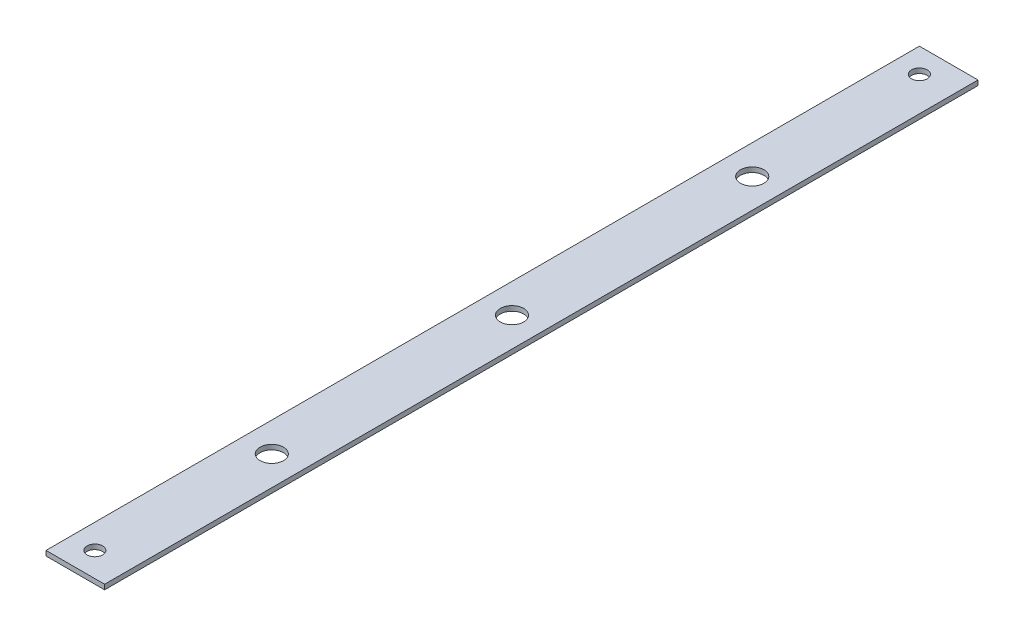
ISO-10303-21;
HEADER;
FILE_DESCRIPTION(('STEP AP214'),'2;1');
FILE_NAME('part.step','',(''),(''),'','','');
FILE_SCHEMA(('AUTOMOTIVE_DESIGN { 1 0 10303 214 1 1 1 1 }'));
ENDSEC;
DATA;
#1=APPLICATION_CONTEXT('core data for automotive mechanical design processes');
#2=APPLICATION_PROTOCOL_DEFINITION('international standard','automotive_design',2000,#1);
#3=PRODUCT_CONTEXT('',#1,'mechanical');
#4=PRODUCT('Part','Part','',(#3));
#5=PRODUCT_RELATED_PRODUCT_CATEGORY('part','',(#4));
#6=PRODUCT_DEFINITION_FORMATION('','',#4);
#7=PRODUCT_DEFINITION_CONTEXT('part definition',#1,'design');
#8=PRODUCT_DEFINITION('design','',#6,#7);
#9=PRODUCT_DEFINITION_SHAPE('','',#8);
#10=(LENGTH_UNIT() NAMED_UNIT(*) SI_UNIT(.MILLI.,.METRE.));
#11=(NAMED_UNIT(*) PLANE_ANGLE_UNIT() SI_UNIT($,.RADIAN.));
#12=(NAMED_UNIT(*) SI_UNIT($,.STERADIAN.) SOLID_ANGLE_UNIT());
#13=UNCERTAINTY_MEASURE_WITH_UNIT(LENGTH_MEASURE(1.E-05),#10,'distance_accuracy_value','');
#14=(GEOMETRIC_REPRESENTATION_CONTEXT(3) GLOBAL_UNCERTAINTY_ASSIGNED_CONTEXT((#13)) GLOBAL_UNIT_ASSIGNED_CONTEXT((#10,
#11,#12)) REPRESENTATION_CONTEXT('',''));
#15=CARTESIAN_POINT('',(0.,0.,0.));
#16=DIRECTION('',(0.,0.,1.));
#17=DIRECTION('',(1.,0.,0.));
#18=AXIS2_PLACEMENT_3D('',#15,#16,#17);
#19=CARTESIAN_POINT('',(30.,0.,223.6));
#20=DIRECTION('',(0.,1.,0.));
#21=DIRECTION('',(-1.,0.,0.));
#22=AXIS2_PLACEMENT_3D('',#19,#20,#21);
#23=PLANE('',#22);
#24=CARTESIAN_POINT('',(15.,0.,-123.));
#25=DIRECTION('',(0.,1.,0.));
#26=DIRECTION('',(1.,0.,0.));
#27=AXIS2_PLACEMENT_3D('',#24,#25,#26);
#28=CIRCLE('',#27,6.00000000000001);
#29=CARTESIAN_POINT('',(21.,0.,-123.));
#30=VERTEX_POINT('',#29);
#31=EDGE_CURVE('E131',#30,#30,#28,.T.);
#32=ORIENTED_EDGE('',*,*,#31,.T.);
#33=EDGE_LOOP('',(#32));
#34=FACE_BOUND('',#33,.T.);
#35=CARTESIAN_POINT('',(15.,0.,123.));
#36=DIRECTION('',(0.,1.,0.));
#37=DIRECTION('',(-1.,0.,0.));
#38=AXIS2_PLACEMENT_3D('',#35,#36,#37);
#39=CIRCLE('',#38,6.00000000000001);
#40=CARTESIAN_POINT('',(8.99999999999999,0.,123.));
#41=VERTEX_POINT('',#40);
#42=EDGE_CURVE('E125',#41,#41,#39,.T.);
#43=ORIENTED_EDGE('',*,*,#42,.T.);
#44=EDGE_LOOP('',(#43));
#45=FACE_BOUND('',#44,.T.);
#46=CARTESIAN_POINT('',(12.5,0.,211.1));
#47=DIRECTION('',(0.,1.,0.));
#48=DIRECTION('',(1.,0.,0.));
#49=AXIS2_PLACEMENT_3D('',#46,#47,#48);
#50=CIRCLE('',#49,4.);
#51=CARTESIAN_POINT('',(16.5,0.,211.1));
#52=VERTEX_POINT('',#51);
#53=EDGE_CURVE('E119',#52,#52,#50,.T.);
#54=ORIENTED_EDGE('',*,*,#53,.T.);
#55=EDGE_LOOP('',(#54));
#56=FACE_BOUND('',#55,.T.);
#57=CARTESIAN_POINT('',(15.,0.,0.));
#58=DIRECTION('',(0.,1.,0.));
#59=DIRECTION('',(-1.,0.,0.));
#60=AXIS2_PLACEMENT_3D('',#57,#58,#59);
#61=CIRCLE('',#60,6.);
#62=CARTESIAN_POINT('',(9.,0.,0.));
#63=VERTEX_POINT('',#62);
#64=EDGE_CURVE('E113',#63,#63,#61,.T.);
#65=ORIENTED_EDGE('',*,*,#64,.T.);
#66=EDGE_LOOP('',(#65));
#67=FACE_BOUND('',#66,.T.);
#68=CARTESIAN_POINT('',(12.5,0.,-211.1));
#69=DIRECTION('',(0.,1.,0.));
#70=DIRECTION('',(-1.,0.,0.));
#71=AXIS2_PLACEMENT_3D('',#68,#69,#70);
#72=CIRCLE('',#71,4.);
#73=CARTESIAN_POINT('',(8.5,0.,-211.1));
#74=VERTEX_POINT('',#73);
#75=EDGE_CURVE('E99',#74,#74,#72,.T.);
#76=ORIENTED_EDGE('',*,*,#75,.T.);
#77=EDGE_LOOP('',(#76));
#78=FACE_BOUND('',#77,.T.);
#79=DIRECTION('',(1.,0.,0.));
#80=VECTOR('',#79,1.);
#81=CARTESIAN_POINT('',(30.,0.,-223.6));
#82=LINE('',#81,#80);
#83=CARTESIAN_POINT('',(0.,0.,-223.6));
#84=VERTEX_POINT('',#83);
#85=CARTESIAN_POINT('',(30.,0.,-223.6));
#86=VERTEX_POINT('',#85);
#87=EDGE_CURVE('E96',#84,#86,#82,.T.);
#88=ORIENTED_EDGE('',*,*,#87,.T.);
#89=DIRECTION('',(0.,0.,-1.));
#90=VECTOR('',#89,1.);
#91=CARTESIAN_POINT('',(30.,0.,223.6));
#92=LINE('',#91,#90);
#93=CARTESIAN_POINT('',(30.,0.,223.6));
#94=VERTEX_POINT('',#93);
#95=EDGE_CURVE('E11',#94,#86,#92,.T.);
#96=ORIENTED_EDGE('',*,*,#95,.F.);
#97=DIRECTION('',(1.,0.,0.));
#98=VECTOR('',#97,1.);
#99=CARTESIAN_POINT('',(30.,0.,223.6));
#100=LINE('',#99,#98);
#101=CARTESIAN_POINT('',(0.,0.,223.6));
#102=VERTEX_POINT('',#101);
#103=EDGE_CURVE('E84',#102,#94,#100,.T.);
#104=ORIENTED_EDGE('',*,*,#103,.F.);
#105=DIRECTION('',(0.,0.,-1.));
#106=VECTOR('',#105,1.);
#107=CARTESIAN_POINT('',(0.,0.,223.6));
#108=LINE('',#107,#106);
#109=EDGE_CURVE('E92',#102,#84,#108,.T.);
#110=ORIENTED_EDGE('',*,*,#109,.T.);
#111=EDGE_LOOP('',(#88,#96,#104,#110));
#112=FACE_BOUND('',#111,.T.);
#113=ADVANCED_FACE('F33',(#34,#45,#56,#67,#78,#112),#23,.F.);
#114=CARTESIAN_POINT('',(30.,2.5,223.6));
#115=DIRECTION('',(-1.,0.,0.));
#116=DIRECTION('',(0.,0.,1.));
#117=AXIS2_PLACEMENT_3D('',#114,#115,#116);
#118=PLANE('',#117);
#119=DIRECTION('',(0.,1.,0.));
#120=VECTOR('',#119,1.);
#121=CARTESIAN_POINT('',(30.,2.5,-223.6));
#122=LINE('',#121,#120);
#123=CARTESIAN_POINT('',(30.,2.5,-223.6));
#124=VERTEX_POINT('',#123);
#125=EDGE_CURVE('E88',#86,#124,#122,.T.);
#126=ORIENTED_EDGE('',*,*,#125,.T.);
#127=DIRECTION('',(0.,0.,-1.));
#128=VECTOR('',#127,1.);
#129=CARTESIAN_POINT('',(30.,2.5,223.6));
#130=LINE('',#129,#128);
#131=CARTESIAN_POINT('',(30.,2.5,223.6));
#132=VERTEX_POINT('',#131);
#133=EDGE_CURVE('E41',#132,#124,#130,.T.);
#134=ORIENTED_EDGE('',*,*,#133,.F.);
#135=DIRECTION('',(0.,1.,0.));
#136=VECTOR('',#135,1.);
#137=CARTESIAN_POINT('',(30.,2.5,223.6));
#138=LINE('',#137,#136);
#139=EDGE_CURVE('E79',#94,#132,#138,.T.);
#140=ORIENTED_EDGE('',*,*,#139,.F.);
#141=ORIENTED_EDGE('',*,*,#95,.T.);
#142=EDGE_LOOP('',(#126,#134,#140,#141));
#143=FACE_BOUND('',#142,.T.);
#144=ADVANCED_FACE('F87',(#143),#118,.F.);
#145=CARTESIAN_POINT('',(0.,2.5,223.6));
#146=DIRECTION('',(0.,-1.,0.));
#147=DIRECTION('',(1.,0.,0.));
#148=AXIS2_PLACEMENT_3D('',#145,#146,#147);
#149=PLANE('',#148);
#150=CARTESIAN_POINT('',(15.,2.5,-123.));
#151=DIRECTION('',(0.,1.,0.));
#152=DIRECTION('',(1.,0.,0.));
#153=AXIS2_PLACEMENT_3D('',#150,#151,#152);
#154=CIRCLE('',#153,6.00000000000001);
#155=CARTESIAN_POINT('',(21.,2.5,-123.));
#156=VERTEX_POINT('',#155);
#157=EDGE_CURVE('E134',#156,#156,#154,.T.);
#158=ORIENTED_EDGE('',*,*,#157,.F.);
#159=EDGE_LOOP('',(#158));
#160=FACE_BOUND('',#159,.T.);
#161=CARTESIAN_POINT('',(15.,2.5,123.));
#162=DIRECTION('',(0.,1.,0.));
#163=DIRECTION('',(-1.,0.,0.));
#164=AXIS2_PLACEMENT_3D('',#161,#162,#163);
#165=CIRCLE('',#164,6.00000000000001);
#166=CARTESIAN_POINT('',(8.99999999999999,2.5,123.));
#167=VERTEX_POINT('',#166);
#168=EDGE_CURVE('E128',#167,#167,#165,.T.);
#169=ORIENTED_EDGE('',*,*,#168,.F.);
#170=EDGE_LOOP('',(#169));
#171=FACE_BOUND('',#170,.T.);
#172=CARTESIAN_POINT('',(12.5,2.5,211.1));
#173=DIRECTION('',(0.,1.,0.));
#174=DIRECTION('',(1.,0.,0.));
#175=AXIS2_PLACEMENT_3D('',#172,#173,#174);
#176=CIRCLE('',#175,4.);
#177=CARTESIAN_POINT('',(16.5,2.5,211.1));
#178=VERTEX_POINT('',#177);
#179=EDGE_CURVE('E122',#178,#178,#176,.T.);
#180=ORIENTED_EDGE('',*,*,#179,.F.);
#181=EDGE_LOOP('',(#180));
#182=FACE_BOUND('',#181,.T.);
#183=CARTESIAN_POINT('',(15.,2.5,0.));
#184=DIRECTION('',(0.,1.,0.));
#185=DIRECTION('',(-1.,0.,0.));
#186=AXIS2_PLACEMENT_3D('',#183,#184,#185);
#187=CIRCLE('',#186,6.);
#188=CARTESIAN_POINT('',(9.,2.5,0.));
#189=VERTEX_POINT('',#188);
#190=EDGE_CURVE('E116',#189,#189,#187,.T.);
#191=ORIENTED_EDGE('',*,*,#190,.F.);
#192=EDGE_LOOP('',(#191));
#193=FACE_BOUND('',#192,.T.);
#194=CARTESIAN_POINT('',(12.5,2.5,-211.1));
#195=DIRECTION('',(0.,1.,0.));
#196=DIRECTION('',(-1.,0.,0.));
#197=AXIS2_PLACEMENT_3D('',#194,#195,#196);
#198=CIRCLE('',#197,4.);
#199=CARTESIAN_POINT('',(8.5,2.5,-211.1));
#200=VERTEX_POINT('',#199);
#201=EDGE_CURVE('E110',#200,#200,#198,.T.);
#202=ORIENTED_EDGE('',*,*,#201,.F.);
#203=EDGE_LOOP('',(#202));
#204=FACE_BOUND('',#203,.T.);
#205=DIRECTION('',(-1.,0.,0.));
#206=VECTOR('',#205,1.);
#207=CARTESIAN_POINT('',(0.,2.5,-223.6));
#208=LINE('',#207,#206);
#209=CARTESIAN_POINT('',(0.,2.5,-223.6));
#210=VERTEX_POINT('',#209);
#211=EDGE_CURVE('E66',#124,#210,#208,.T.);
#212=ORIENTED_EDGE('',*,*,#211,.T.);
#213=DIRECTION('',(0.,0.,-1.));
#214=VECTOR('',#213,1.);
#215=CARTESIAN_POINT('',(0.,2.5,223.6));
#216=LINE('',#215,#214);
#217=CARTESIAN_POINT('',(0.,2.5,223.6));
#218=VERTEX_POINT('',#217);
#219=EDGE_CURVE('E89',#218,#210,#216,.T.);
#220=ORIENTED_EDGE('',*,*,#219,.F.);
#221=DIRECTION('',(-1.,0.,0.));
#222=VECTOR('',#221,1.);
#223=CARTESIAN_POINT('',(0.,2.5,223.6));
#224=LINE('',#223,#222);
#225=EDGE_CURVE('E82',#132,#218,#224,.T.);
#226=ORIENTED_EDGE('',*,*,#225,.F.);
#227=ORIENTED_EDGE('',*,*,#133,.T.);
#228=EDGE_LOOP('',(#212,#220,#226,#227));
#229=FACE_BOUND('',#228,.T.);
#230=ADVANCED_FACE('F90',(#160,#171,#182,#193,#204,#229),#149,.F.);
#231=CARTESIAN_POINT('',(0.,0.,223.6));
#232=DIRECTION('',(1.,0.,0.));
#233=DIRECTION('',(0.,0.,-1.));
#234=AXIS2_PLACEMENT_3D('',#231,#232,#233);
#235=PLANE('',#234);
#236=DIRECTION('',(0.,-1.,0.));
#237=VECTOR('',#236,1.);
#238=CARTESIAN_POINT('',(0.,0.,-223.6));
#239=LINE('',#238,#237);
#240=EDGE_CURVE('E72',#210,#84,#239,.T.);
#241=ORIENTED_EDGE('',*,*,#240,.T.);
#242=ORIENTED_EDGE('',*,*,#109,.F.);
#243=DIRECTION('',(0.,-1.,0.));
#244=VECTOR('',#243,1.);
#245=CARTESIAN_POINT('',(0.,0.,223.6));
#246=LINE('',#245,#244);
#247=EDGE_CURVE('E49',#218,#102,#246,.T.);
#248=ORIENTED_EDGE('',*,*,#247,.F.);
#249=ORIENTED_EDGE('',*,*,#219,.T.);
#250=EDGE_LOOP('',(#241,#242,#248,#249));
#251=FACE_BOUND('',#250,.T.);
#252=ADVANCED_FACE('F104',(#251),#235,.F.);
#253=CARTESIAN_POINT('',(0.,0.,223.6));
#254=DIRECTION('',(0.,0.,-1.));
#255=DIRECTION('',(-1.,0.,0.));
#256=AXIS2_PLACEMENT_3D('',#253,#254,#255);
#257=PLANE('',#256);
#258=ORIENTED_EDGE('',*,*,#103,.T.);
#259=ORIENTED_EDGE('',*,*,#139,.T.);
#260=ORIENTED_EDGE('',*,*,#225,.T.);
#261=ORIENTED_EDGE('',*,*,#247,.T.);
#262=EDGE_LOOP('',(#258,#259,#260,#261));
#263=FACE_BOUND('',#262,.T.);
#264=ADVANCED_FACE('F80',(#263),#257,.F.);
#265=CARTESIAN_POINT('',(0.,0.,-223.6));
#266=DIRECTION('',(0.,0.,-1.));
#267=DIRECTION('',(-1.,0.,0.));
#268=AXIS2_PLACEMENT_3D('',#265,#266,#267);
#269=PLANE('',#268);
#270=ORIENTED_EDGE('',*,*,#87,.F.);
#271=ORIENTED_EDGE('',*,*,#240,.F.);
#272=ORIENTED_EDGE('',*,*,#211,.F.);
#273=ORIENTED_EDGE('',*,*,#125,.F.);
#274=EDGE_LOOP('',(#270,#271,#272,#273));
#275=FACE_BOUND('',#274,.T.);
#276=ADVANCED_FACE('F107',(#275),#269,.T.);
#277=CARTESIAN_POINT('',(12.5,0.,-211.1));
#278=DIRECTION('',(0.,1.,0.));
#279=DIRECTION('',(-1.,0.,0.));
#280=AXIS2_PLACEMENT_3D('',#277,#278,#279);
#281=CYLINDRICAL_SURFACE('',#280,4.);
#282=ORIENTED_EDGE('',*,*,#75,.F.);
#283=EDGE_LOOP('',(#282));
#284=FACE_BOUND('',#283,.T.);
#285=ORIENTED_EDGE('',*,*,#201,.T.);
#286=EDGE_LOOP('',(#285));
#287=FACE_BOUND('',#286,.T.);
#288=ADVANCED_FACE('F160',(#284,#287),#281,.F.);
#289=CARTESIAN_POINT('',(15.,0.,0.));
#290=DIRECTION('',(0.,1.,0.));
#291=DIRECTION('',(-1.,0.,0.));
#292=AXIS2_PLACEMENT_3D('',#289,#290,#291);
#293=CYLINDRICAL_SURFACE('',#292,6.);
#294=ORIENTED_EDGE('',*,*,#64,.F.);
#295=EDGE_LOOP('',(#294));
#296=FACE_BOUND('',#295,.T.);
#297=ORIENTED_EDGE('',*,*,#190,.T.);
#298=EDGE_LOOP('',(#297));
#299=FACE_BOUND('',#298,.T.);
#300=ADVANCED_FACE('F162',(#296,#299),#293,.F.);
#301=CARTESIAN_POINT('',(12.5,0.,211.1));
#302=DIRECTION('',(0.,1.,0.));
#303=DIRECTION('',(-1.,0.,0.));
#304=AXIS2_PLACEMENT_3D('',#301,#302,#303);
#305=CYLINDRICAL_SURFACE('',#304,4.);
#306=ORIENTED_EDGE('',*,*,#53,.F.);
#307=EDGE_LOOP('',(#306));
#308=FACE_BOUND('',#307,.T.);
#309=ORIENTED_EDGE('',*,*,#179,.T.);
#310=EDGE_LOOP('',(#309));
#311=FACE_BOUND('',#310,.T.);
#312=ADVANCED_FACE('F169',(#308,#311),#305,.F.);
#313=CARTESIAN_POINT('',(15.,0.,123.));
#314=DIRECTION('',(0.,1.,0.));
#315=DIRECTION('',(-1.,0.,0.));
#316=AXIS2_PLACEMENT_3D('',#313,#314,#315);
#317=CYLINDRICAL_SURFACE('',#316,6.00000000000001);
#318=ORIENTED_EDGE('',*,*,#42,.F.);
#319=EDGE_LOOP('',(#318));
#320=FACE_BOUND('',#319,.T.);
#321=ORIENTED_EDGE('',*,*,#168,.T.);
#322=EDGE_LOOP('',(#321));
#323=FACE_BOUND('',#322,.T.);
#324=ADVANCED_FACE('F145',(#320,#323),#317,.F.);
#325=CARTESIAN_POINT('',(15.,0.,-123.));
#326=DIRECTION('',(0.,1.,0.));
#327=DIRECTION('',(-1.,0.,0.));
#328=AXIS2_PLACEMENT_3D('',#325,#326,#327);
#329=CYLINDRICAL_SURFACE('',#328,6.00000000000001);
#330=ORIENTED_EDGE('',*,*,#31,.F.);
#331=EDGE_LOOP('',(#330));
#332=FACE_BOUND('',#331,.T.);
#333=ORIENTED_EDGE('',*,*,#157,.T.);
#334=EDGE_LOOP('',(#333));
#335=FACE_BOUND('',#334,.T.);
#336=ADVANCED_FACE('F142',(#332,#335),#329,.F.);
#337=CLOSED_SHELL('',(#113,#144,#230,#252,#264,#276,#288,#300,#312,#324,#336));
#338=MANIFOLD_SOLID_BREP('B2',#337);
#339=ADVANCED_BREP_SHAPE_REPRESENTATION('',(#18,#338),#14);
#340=SHAPE_DEFINITION_REPRESENTATION(#9,#339);
ENDSEC;
END-ISO-10303-21;
